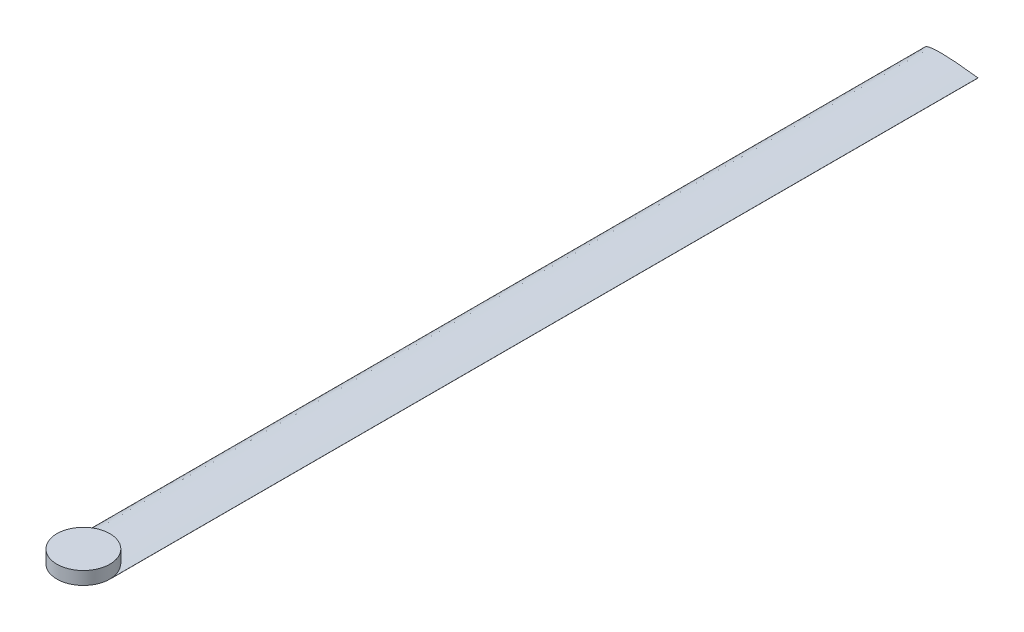
ISO-10303-21;
HEADER;
FILE_DESCRIPTION(('STEP AP214'),'2;1');
FILE_NAME('part.step','',(''),(''),'','','');
FILE_SCHEMA(('AUTOMOTIVE_DESIGN { 1 0 10303 214 1 1 1 1 }'));
ENDSEC;
DATA;
#1=APPLICATION_CONTEXT('core data for automotive mechanical design processes');
#2=APPLICATION_PROTOCOL_DEFINITION('international standard','automotive_design',2000,#1);
#3=PRODUCT_CONTEXT('',#1,'mechanical');
#4=PRODUCT('Part','Part','',(#3));
#5=PRODUCT_RELATED_PRODUCT_CATEGORY('part','',(#4));
#6=PRODUCT_DEFINITION_FORMATION('','',#4);
#7=PRODUCT_DEFINITION_CONTEXT('part definition',#1,'design');
#8=PRODUCT_DEFINITION('design','',#6,#7);
#9=PRODUCT_DEFINITION_SHAPE('','',#8);
#10=(LENGTH_UNIT() NAMED_UNIT(*) SI_UNIT(.MILLI.,.METRE.));
#11=(NAMED_UNIT(*) PLANE_ANGLE_UNIT() SI_UNIT($,.RADIAN.));
#12=(NAMED_UNIT(*) SI_UNIT($,.STERADIAN.) SOLID_ANGLE_UNIT());
#13=UNCERTAINTY_MEASURE_WITH_UNIT(LENGTH_MEASURE(1.E-05),#10,'distance_accuracy_value','');
#14=(GEOMETRIC_REPRESENTATION_CONTEXT(3) GLOBAL_UNCERTAINTY_ASSIGNED_CONTEXT((#13)) GLOBAL_UNIT_ASSIGNED_CONTEXT((#10,
#11,#12)) REPRESENTATION_CONTEXT('',''));
#15=CARTESIAN_POINT('',(0.,0.,0.));
#16=DIRECTION('',(0.,0.,1.));
#17=DIRECTION('',(1.,0.,0.));
#18=AXIS2_PLACEMENT_3D('',#15,#16,#17);
#19=CARTESIAN_POINT('',(51.92458627,0.0654249787001999,-850.9));
#20=CARTESIAN_POINT('',(51.9144783536364,0.0668447481727603,-850.9));
#21=CARTESIAN_POINT('',(51.8740830158601,0.0725187234358362,-850.9));
#22=CARTESIAN_POINT('',(51.7128637741761,0.0950667716006075,-850.9));
#23=CARTESIAN_POINT('',(51.4715233011047,0.128771260971707,-850.9));
#24=CARTESIAN_POINT('',(51.1505590289266,0.173034788527764,-850.9));
#25=CARTESIAN_POINT('',(50.6729577657384,0.238699258043555,-850.9));
#26=CARTESIAN_POINT('',(50.1185157582041,0.313734293269559,-850.9));
#27=CARTESIAN_POINT('',(49.4885484553398,0.397767262475903,-850.9));
#28=CARTESIAN_POINT('',(48.9329284944863,0.470958753954172,-850.9));
#29=CARTESIAN_POINT('',(48.323662112315,0.550211076788461,-850.9));
#30=CARTESIAN_POINT('',(47.6621596521929,0.634888079607421,-850.9));
#31=CARTESIAN_POINT('',(46.6804212513733,0.758797338868999,-850.9));
#32=CARTESIAN_POINT('',(45.6344086297018,0.887388606786109,-850.9));
#33=CARTESIAN_POINT('',(44.5265420078138,1.0200224475314,-850.9));
#34=CARTESIAN_POINT('',(43.6294002554142,1.12535680085555,-850.9));
#35=CARTESIAN_POINT('',(42.6909656012077,1.23317914934233,-850.9));
#36=CARTESIAN_POINT('',(41.7134832049201,1.34321413197957,-850.9));
#37=CARTESIAN_POINT('',(40.6992053320691,1.45467240980085,-850.9));
#38=CARTESIAN_POINT('',(39.6505330297207,1.56725462921075,-850.9));
#39=CARTESIAN_POINT('',(38.5698744395896,1.68015625719945,-850.9));
#40=CARTESIAN_POINT('',(37.4597768936603,1.79316807294359,-850.9));
#41=CARTESIAN_POINT('',(36.3228194278996,1.90541863053479,-850.9));
#42=CARTESIAN_POINT('',(35.161675349151,2.0165553793621,-850.9));
#43=CARTESIAN_POINT('',(33.9790410450409,2.12580642633234,-850.9));
#44=CARTESIAN_POINT('',(32.777675311037,2.23281458710381,-850.9));
#45=CARTESIAN_POINT('',(31.5603913403238,2.33669524197887,-850.9));
#46=CARTESIAN_POINT('',(30.3300258884586,2.43698374361292,-850.9));
#47=CARTESIAN_POINT('',(29.0894680865248,2.53303963360723,-850.9));
#48=CARTESIAN_POINT('',(27.8415994829786,2.6240918225609,-850.9));
#49=CARTESIAN_POINT('',(26.5893526219318,2.70956924053514,-850.9));
#50=CARTESIAN_POINT('',(25.3356506945839,2.78878910813732,-850.9));
#51=CARTESIAN_POINT('',(23.2597463755809,2.90847283819553,-850.9));
#52=CARTESIAN_POINT('',(20.7948097579276,3.02181352063605,-850.9));
#53=CARTESIAN_POINT('',(18.35209977267,3.08909783236487,-850.9));
#54=CARTESIAN_POINT('',(16.3839182784895,3.11769357604497,-850.9));
#55=CARTESIAN_POINT('',(14.852242451324,3.11884802097125,-850.9));
#56=CARTESIAN_POINT('',(13.3547291194537,3.09580791737897,-850.9));
#57=CARTESIAN_POINT('',(11.9352696395051,3.05732465958781,-850.9));
#58=CARTESIAN_POINT('',(10.5601382378665,2.99492912711388,-850.9));
#59=CARTESIAN_POINT('',(9.23317923883581,2.90532852092417,-850.9));
#60=CARTESIAN_POINT('',(8.29460829016419,2.82709313644025,-850.9));
#61=CARTESIAN_POINT('',(7.39728054278529,2.73677746916051,-850.9));
#62=CARTESIAN_POINT('',(6.54328096737141,2.6347241286792,-850.9));
#63=CARTESIAN_POINT('',(5.73457836693464,2.52134793339236,-850.9));
#64=CARTESIAN_POINT('',(4.97307785227524,2.39686022629011,-850.9));
#65=CARTESIAN_POINT('',(4.26052463876455,2.26188317711306,-850.9));
#66=CARTESIAN_POINT('',(3.59855865588192,2.11692431925331,-850.9));
#67=CARTESIAN_POINT('',(2.98872697214177,1.96247504893881,-850.9));
#68=CARTESIAN_POINT('',(2.43237712539489,1.79922727333092,-850.9));
#69=CARTESIAN_POINT('',(1.93073586614819,1.62772313762752,-850.9));
#70=CARTESIAN_POINT('',(1.4848729717453,1.44855497915412,-850.9));
#71=CARTESIAN_POINT('',(1.09567104825382,1.26223966436095,-850.9));
#72=CARTESIAN_POINT('',(0.763871575985361,1.06916509269666,-850.9));
#73=CARTESIAN_POINT('',(0.489860921674484,0.869658563365734,-850.9));
#74=CARTESIAN_POINT('',(0.274168548188181,0.663391899468714,-850.9));
#75=CARTESIAN_POINT('',(0.117314603685006,0.449780781763098,-850.9));
#76=CARTESIAN_POINT('',(0.0214138545634771,0.227781104297802,-850.9));
#77=CARTESIAN_POINT('',(-0.0104380093622145,1.39967940785302E-12,-850.9));
#78=CARTESIAN_POINT('',(0.0214138545634639,-0.22778110429499,-850.9));
#79=CARTESIAN_POINT('',(0.117314603684984,-0.449780781760301,-850.9));
#80=CARTESIAN_POINT('',(0.274168548188143,-0.663391899465917,-850.9));
#81=CARTESIAN_POINT('',(0.489860921674437,-0.869658563362954,-850.9));
#82=CARTESIAN_POINT('',(0.763871575985304,-1.06916509269389,-850.9));
#83=CARTESIAN_POINT('',(1.09567104825375,-1.2622396643582,-850.9));
#84=CARTESIAN_POINT('',(1.48487297174523,-1.4485549791514,-850.9));
#85=CARTESIAN_POINT('',(1.9307358661481,-1.62772313762481,-850.9));
#86=CARTESIAN_POINT('',(2.43237712539479,-1.79922727332824,-850.9));
#87=CARTESIAN_POINT('',(2.98872697214167,-1.96247504893616,-850.9));
#88=CARTESIAN_POINT('',(3.59855865588181,-2.11692431925069,-850.9));
#89=CARTESIAN_POINT('',(4.26052463876442,-2.26188317711048,-850.9));
#90=CARTESIAN_POINT('',(4.97307785227512,-2.39686022628757,-850.9));
#91=CARTESIAN_POINT('',(5.73457836693449,-2.52134793338986,-850.9));
#92=CARTESIAN_POINT('',(6.54328096737127,-2.63472412867675,-850.9));
#93=CARTESIAN_POINT('',(7.39728054278514,-2.7367774691581,-850.9));
#94=CARTESIAN_POINT('',(8.29460829016404,-2.82709313643789,-850.9));
#95=CARTESIAN_POINT('',(9.23317923883565,-2.90532852092186,-850.9));
#96=CARTESIAN_POINT('',(10.5601382378664,-2.99492912711164,-850.9));
#97=CARTESIAN_POINT('',(11.935269639505,-3.05732465958565,-850.9));
#98=CARTESIAN_POINT('',(13.3547291194535,-3.09580791737688,-850.9));
#99=CARTESIAN_POINT('',(14.8522424513238,-3.11884802096924,-850.9));
#100=CARTESIAN_POINT('',(16.3839182784893,-3.11769357604306,-850.9));
#101=CARTESIAN_POINT('',(18.3520997726698,-3.08909783236305,-850.9));
#102=CARTESIAN_POINT('',(20.3781183845229,-3.03329126151724,-850.9));
#103=CARTESIAN_POINT('',(22.425332849603,-2.94682683555158,-850.9));
#104=CARTESIAN_POINT('',(24.0833956272909,-2.86098634577627,-850.9));
#105=CARTESIAN_POINT('',(25.3356506945838,-2.78878910813588,-850.9));
#106=CARTESIAN_POINT('',(26.5893526219316,-2.70956924053377,-850.9));
#107=CARTESIAN_POINT('',(27.8415994829784,-2.6240918225596,-850.9));
#108=CARTESIAN_POINT('',(29.0894680865247,-2.53303963360599,-850.9));
#109=CARTESIAN_POINT('',(30.3300258884584,-2.43698374361175,-850.9));
#110=CARTESIAN_POINT('',(31.5603913403237,-2.33669524197777,-850.9));
#111=CARTESIAN_POINT('',(32.7776753110368,-2.23281458710278,-850.9));
#112=CARTESIAN_POINT('',(33.9790410450408,-2.12580642633137,-850.9));
#113=CARTESIAN_POINT('',(35.1616753491508,-2.0165553793612,-850.9));
#114=CARTESIAN_POINT('',(36.3228194278995,-1.90541863053395,-850.9));
#115=CARTESIAN_POINT('',(37.4597768936601,-1.79316807294281,-850.9));
#116=CARTESIAN_POINT('',(38.5698744395896,-1.68015625719873,-850.9));
#117=CARTESIAN_POINT('',(39.6505330297206,-1.56725462921009,-850.9));
#118=CARTESIAN_POINT('',(40.6992053320691,-1.45467240980024,-850.9));
#119=CARTESIAN_POINT('',(41.71348320492,-1.34321413197902,-850.9));
#120=CARTESIAN_POINT('',(42.6909656012077,-1.23317914934183,-850.9));
#121=CARTESIAN_POINT('',(43.6294002554142,-1.1253568008551,-850.9));
#122=CARTESIAN_POINT('',(44.5265420078137,-1.020022447531,-850.9));
#123=CARTESIAN_POINT('',(45.6344086297018,-0.887388606785768,-850.9));
#124=CARTESIAN_POINT('',(46.6804212513733,-0.758797338868717,-850.9));
#125=CARTESIAN_POINT('',(47.6621596521928,-0.63488807960719,-850.9));
#126=CARTESIAN_POINT('',(48.3236621123149,-0.550211076788267,-850.9));
#127=CARTESIAN_POINT('',(48.9329284944863,-0.47095875395401,-850.9));
#128=CARTESIAN_POINT('',(49.4885484553397,-0.397767262475771,-850.9));
#129=CARTESIAN_POINT('',(50.1185157582041,-0.313734293269462,-850.9));
#130=CARTESIAN_POINT('',(50.6729577657383,-0.238699258043488,-850.9));
#131=CARTESIAN_POINT('',(51.1505590289266,-0.173034788527721,-850.9));
#132=CARTESIAN_POINT('',(51.4715233011047,-0.128771260971681,-850.9));
#133=CARTESIAN_POINT('',(51.7128637741761,-0.0950667716005953,-850.9));
#134=CARTESIAN_POINT('',(51.8740830158602,-0.072518723435834,-850.9));
#135=CARTESIAN_POINT('',(51.9144783536364,-0.0668447481727592,-850.9));
#136=CARTESIAN_POINT('',(51.92458627,-0.0654249787001999,-850.9));
#137=B_SPLINE_CURVE_WITH_KNOTS('',3,(#19,#20,#21,#22,#23,#24,#25,#26,#27,#28,#29,#30,#31,#32,
#33,#34,#35,#36,#37,#38,#39,#40,#41,#42,#43,#44,#45,#46,#47,#48,#49,#50,#51,#52,#53,#54,#55,#56,
#57,#58,#59,#60,#61,#62,#63,#64,#65,#66,#67,#68,#69,#70,#71,#72,#73,#74,#75,#76,#77,#78,#79,#80,
#81,#82,#83,#84,#85,#86,#87,#88,#89,#90,#91,#92,#93,#94,#95,#96,#97,#98,#99,#100,#101,#102,#103,
#104,#105,#106,#107,#108,#109,#110,#111,#112,#113,#114,#115,#116,#117,#118,#119,#120,#121,#122,
#123,#124,#125,#126,#127,#128,#129,#130,#131,#132,#133,#134,#135,#136),.UNSPECIFIED.,.F.,.F.,(4,
1,1,1,1,1,1,1,1,1,1,1,1,1,1,1,1,1,1,1,1,1,1,1,1,1,1,1,1,1,1,1,1,1,1,1,1,1,1,1,1,1,1,1,1,1,1,1,1,
1,1,1,1,1,1,1,1,1,1,1,1,1,1,1,1,1,1,1,1,1,1,1,1,1,1,1,1,1,1,1,1,1,1,1,1,1,1,1,1,1,1,1,1,1,1,1,1,
1,1,1,1,1,1,1,1,1,1,1,1,1,1,1,1,1,1,4),(0.,0.000289201378228584,0.00115576612811508,
0.00461232240327471,0.00719351750498146,0.0103357928948401,0.0182716120853123,
0.0230458473649681,0.0283429008690871,0.0341501195438393,0.0404537601194177,0.0472383298988339,
0.0621866127014251,0.0703137241968131,0.0788519079930911,0.0877801263970524,0.0970775209084771,
0.106722048517726,0.116690867689892,0.126960504753417,0.137507218023907,0.148306054540842,
0.159330764906486,0.170556489755233,0.181956531155254,0.193504043461122,0.205171366742429,
0.216932300344852,0.228758168756788,0.240621400483931,0.252494935762872,0.264350287074715,
0.299535853600575,0.322404758964058,0.333584031906799,0.35530595971865,0.365799778375851,
0.376017570419826,0.395537658905913,0.404797976198219,0.413698812078543,0.422221441287427,
0.430349273099823,0.438066019294824,0.445356904422305,0.452209372098903,0.458611567079498,
0.464554044050621,0.470029850192537,0.475034902370301,0.479569141493347,0.483636857140142,
0.487250262770083,0.490431337960153,0.493218828079602,0.495674085869199,0.497891368316545,0.5,
0.502108631683455,0.504325914130801,0.506781171920398,0.509568662039847,0.512749737229918,
0.516363142859858,0.520430858506654,0.524965097629699,0.529970149807464,0.53544595594938,
0.541388432920502,0.547790627901097,0.554643095577695,0.561933980705176,0.569650726900178,
0.577778558712573,0.586301187921457,0.595202023801781,0.604462341094087,0.623982429580174,
0.634200221624149,0.64469404028135,0.666415968093201,0.677595241035943,0.700464146399425,
0.723839426647284,0.735649712925285,0.747505064237128,0.75937859951607,0.771241831243213,
0.783067699655148,0.794828633257572,0.806495956538878,0.818043468844746,0.829443510244768,
0.840669235093514,0.851693945459158,0.862492781976093,0.873039495246583,0.883309132310108,
0.893277951482274,0.902922479091523,0.912219873602948,0.921148092006909,0.929686275803187,
0.937813387298575,0.952761670101166,0.959546239880582,0.965849880456161,0.971657099130913,
0.976954152635032,0.981728387914688,0.98966420710516,0.992806482495019,0.995387677596725,
0.998844233871885,0.999710798621771,1.),.UNSPECIFIED.);
#138=DIRECTION('',(0.,0.,1.));
#139=VECTOR('',#138,1.);
#140=SURFACE_OF_LINEAR_EXTRUSION('',#137,#139);
#141=CARTESIAN_POINT('',(51.92458627,0.0654249787001999,0.));
#142=CARTESIAN_POINT('',(51.9144783536364,0.0668447481727603,0.));
#143=CARTESIAN_POINT('',(51.8740830158601,0.0725187234358362,0.));
#144=CARTESIAN_POINT('',(51.7128637741761,0.0950667716006075,0.));
#145=CARTESIAN_POINT('',(51.4715233011047,0.128771260971707,0.));
#146=CARTESIAN_POINT('',(51.1505590289266,0.173034788527764,0.));
#147=CARTESIAN_POINT('',(50.6729577657384,0.238699258043555,0.));
#148=CARTESIAN_POINT('',(50.1185157582041,0.313734293269559,0.));
#149=CARTESIAN_POINT('',(49.4885484553398,0.397767262475903,0.));
#150=CARTESIAN_POINT('',(48.9329284944863,0.470958753954172,0.));
#151=CARTESIAN_POINT('',(48.323662112315,0.550211076788461,0.));
#152=CARTESIAN_POINT('',(47.6621596521929,0.634888079607421,0.));
#153=CARTESIAN_POINT('',(46.6804212513733,0.758797338868999,0.));
#154=CARTESIAN_POINT('',(45.6344086297018,0.887388606786109,0.));
#155=CARTESIAN_POINT('',(44.5265420078138,1.0200224475314,0.));
#156=CARTESIAN_POINT('',(43.6294002554142,1.12535680085555,0.));
#157=CARTESIAN_POINT('',(42.6909656012077,1.23317914934233,0.));
#158=CARTESIAN_POINT('',(41.7134832049201,1.34321413197957,0.));
#159=CARTESIAN_POINT('',(40.6992053320691,1.45467240980085,0.));
#160=CARTESIAN_POINT('',(39.6505330297207,1.56725462921075,0.));
#161=CARTESIAN_POINT('',(38.5698744395896,1.68015625719945,0.));
#162=CARTESIAN_POINT('',(37.4597768936603,1.79316807294359,0.));
#163=CARTESIAN_POINT('',(36.3228194278996,1.90541863053479,0.));
#164=CARTESIAN_POINT('',(35.161675349151,2.0165553793621,0.));
#165=CARTESIAN_POINT('',(33.9790410450409,2.12580642633234,0.));
#166=CARTESIAN_POINT('',(32.777675311037,2.23281458710381,0.));
#167=CARTESIAN_POINT('',(31.5603913403238,2.33669524197887,0.));
#168=CARTESIAN_POINT('',(30.3300258884586,2.43698374361292,0.));
#169=CARTESIAN_POINT('',(29.0894680865248,2.53303963360723,0.));
#170=CARTESIAN_POINT('',(27.8415994829786,2.6240918225609,0.));
#171=CARTESIAN_POINT('',(26.5893526219318,2.70956924053514,0.));
#172=CARTESIAN_POINT('',(25.3356506945839,2.78878910813732,0.));
#173=CARTESIAN_POINT('',(23.2597463755809,2.90847283819553,0.));
#174=CARTESIAN_POINT('',(20.7948097579276,3.02181352063605,0.));
#175=CARTESIAN_POINT('',(18.35209977267,3.08909783236487,0.));
#176=CARTESIAN_POINT('',(16.3839182784895,3.11769357604497,0.));
#177=CARTESIAN_POINT('',(14.852242451324,3.11884802097125,0.));
#178=CARTESIAN_POINT('',(13.3547291194537,3.09580791737897,0.));
#179=CARTESIAN_POINT('',(11.9352696395051,3.05732465958781,0.));
#180=CARTESIAN_POINT('',(10.5601382378665,2.99492912711388,0.));
#181=CARTESIAN_POINT('',(9.23317923883581,2.90532852092417,0.));
#182=CARTESIAN_POINT('',(8.29460829016419,2.82709313644025,0.));
#183=CARTESIAN_POINT('',(7.39728054278529,2.73677746916051,0.));
#184=CARTESIAN_POINT('',(6.54328096737141,2.6347241286792,0.));
#185=CARTESIAN_POINT('',(5.73457836693464,2.52134793339236,0.));
#186=CARTESIAN_POINT('',(4.97307785227524,2.39686022629011,0.));
#187=CARTESIAN_POINT('',(4.26052463876455,2.26188317711306,0.));
#188=CARTESIAN_POINT('',(3.59855865588192,2.11692431925331,0.));
#189=CARTESIAN_POINT('',(2.98872697214177,1.96247504893881,0.));
#190=CARTESIAN_POINT('',(2.43237712539489,1.79922727333092,0.));
#191=CARTESIAN_POINT('',(1.93073586614819,1.62772313762752,0.));
#192=CARTESIAN_POINT('',(1.4848729717453,1.44855497915412,0.));
#193=CARTESIAN_POINT('',(1.09567104825382,1.26223966436095,0.));
#194=CARTESIAN_POINT('',(0.763871575985361,1.06916509269666,0.));
#195=CARTESIAN_POINT('',(0.489860921674484,0.869658563365734,0.));
#196=CARTESIAN_POINT('',(0.274168548188181,0.663391899468714,0.));
#197=CARTESIAN_POINT('',(0.117314603685006,0.449780781763098,0.));
#198=CARTESIAN_POINT('',(0.0214138545634771,0.227781104297802,0.));
#199=CARTESIAN_POINT('',(-0.0104380093622145,1.39967940785302E-12,0.));
#200=CARTESIAN_POINT('',(0.0214138545634639,-0.22778110429499,0.));
#201=CARTESIAN_POINT('',(0.117314603684984,-0.449780781760301,0.));
#202=CARTESIAN_POINT('',(0.274168548188143,-0.663391899465917,0.));
#203=CARTESIAN_POINT('',(0.489860921674437,-0.869658563362954,0.));
#204=CARTESIAN_POINT('',(0.763871575985304,-1.06916509269389,0.));
#205=CARTESIAN_POINT('',(1.09567104825375,-1.2622396643582,0.));
#206=CARTESIAN_POINT('',(1.48487297174523,-1.4485549791514,0.));
#207=CARTESIAN_POINT('',(1.9307358661481,-1.62772313762481,0.));
#208=CARTESIAN_POINT('',(2.43237712539479,-1.79922727332824,0.));
#209=CARTESIAN_POINT('',(2.98872697214167,-1.96247504893616,0.));
#210=CARTESIAN_POINT('',(3.59855865588181,-2.11692431925069,0.));
#211=CARTESIAN_POINT('',(4.26052463876442,-2.26188317711048,0.));
#212=CARTESIAN_POINT('',(4.97307785227512,-2.39686022628757,0.));
#213=CARTESIAN_POINT('',(5.73457836693449,-2.52134793338986,0.));
#214=CARTESIAN_POINT('',(6.54328096737127,-2.63472412867675,0.));
#215=CARTESIAN_POINT('',(7.39728054278514,-2.7367774691581,0.));
#216=CARTESIAN_POINT('',(8.29460829016404,-2.82709313643789,0.));
#217=CARTESIAN_POINT('',(9.23317923883565,-2.90532852092186,0.));
#218=CARTESIAN_POINT('',(10.5601382378664,-2.99492912711164,0.));
#219=CARTESIAN_POINT('',(11.935269639505,-3.05732465958565,0.));
#220=CARTESIAN_POINT('',(13.3547291194535,-3.09580791737688,0.));
#221=CARTESIAN_POINT('',(14.8522424513238,-3.11884802096924,0.));
#222=CARTESIAN_POINT('',(16.3839182784893,-3.11769357604306,0.));
#223=CARTESIAN_POINT('',(18.3520997726698,-3.08909783236305,0.));
#224=CARTESIAN_POINT('',(20.3781183845229,-3.03329126151724,0.));
#225=CARTESIAN_POINT('',(22.425332849603,-2.94682683555158,0.));
#226=CARTESIAN_POINT('',(24.0833956272909,-2.86098634577627,0.));
#227=CARTESIAN_POINT('',(25.3356506945838,-2.78878910813588,0.));
#228=CARTESIAN_POINT('',(26.5893526219316,-2.70956924053377,0.));
#229=CARTESIAN_POINT('',(27.8415994829784,-2.6240918225596,0.));
#230=CARTESIAN_POINT('',(29.0894680865247,-2.53303963360599,0.));
#231=CARTESIAN_POINT('',(30.3300258884584,-2.43698374361175,0.));
#232=CARTESIAN_POINT('',(31.5603913403237,-2.33669524197777,0.));
#233=CARTESIAN_POINT('',(32.7776753110368,-2.23281458710278,0.));
#234=CARTESIAN_POINT('',(33.9790410450408,-2.12580642633137,0.));
#235=CARTESIAN_POINT('',(35.1616753491508,-2.0165553793612,0.));
#236=CARTESIAN_POINT('',(36.3228194278995,-1.90541863053395,0.));
#237=CARTESIAN_POINT('',(37.4597768936601,-1.79316807294281,0.));
#238=CARTESIAN_POINT('',(38.5698744395896,-1.68015625719873,0.));
#239=CARTESIAN_POINT('',(39.6505330297206,-1.56725462921009,0.));
#240=CARTESIAN_POINT('',(40.6992053320691,-1.45467240980024,0.));
#241=CARTESIAN_POINT('',(41.71348320492,-1.34321413197902,0.));
#242=CARTESIAN_POINT('',(42.6909656012077,-1.23317914934183,0.));
#243=CARTESIAN_POINT('',(43.6294002554142,-1.1253568008551,0.));
#244=CARTESIAN_POINT('',(44.5265420078137,-1.020022447531,0.));
#245=CARTESIAN_POINT('',(45.6344086297018,-0.887388606785768,0.));
#246=CARTESIAN_POINT('',(46.6804212513733,-0.758797338868717,0.));
#247=CARTESIAN_POINT('',(47.6621596521928,-0.63488807960719,0.));
#248=CARTESIAN_POINT('',(48.3236621123149,-0.550211076788267,0.));
#249=CARTESIAN_POINT('',(48.9329284944863,-0.47095875395401,0.));
#250=CARTESIAN_POINT('',(49.4885484553397,-0.397767262475771,0.));
#251=CARTESIAN_POINT('',(50.1185157582041,-0.313734293269462,0.));
#252=CARTESIAN_POINT('',(50.6729577657383,-0.238699258043488,0.));
#253=CARTESIAN_POINT('',(51.1505590289266,-0.173034788527721,0.));
#254=CARTESIAN_POINT('',(51.4715233011047,-0.128771260971681,0.));
#255=CARTESIAN_POINT('',(51.7128637741761,-0.0950667716005953,0.));
#256=CARTESIAN_POINT('',(51.8740830158602,-0.072518723435834,0.));
#257=CARTESIAN_POINT('',(51.9144783536364,-0.0668447481727592,0.));
#258=CARTESIAN_POINT('',(51.92458627,-0.0654249787001999,0.));
#259=B_SPLINE_CURVE_WITH_KNOTS('',3,(#141,#142,#143,#144,#145,#146,#147,#148,#149,#150,#151,
#152,#153,#154,#155,#156,#157,#158,#159,#160,#161,#162,#163,#164,#165,#166,#167,#168,#169,#170,
#171,#172,#173,#174,#175,#176,#177,#178,#179,#180,#181,#182,#183,#184,#185,#186,#187,#188,#189,
#190,#191,#192,#193,#194,#195,#196,#197,#198,#199,#200,#201,#202,#203,#204,#205,#206,#207,#208,
#209,#210,#211,#212,#213,#214,#215,#216,#217,#218,#219,#220,#221,#222,#223,#224,#225,#226,#227,
#228,#229,#230,#231,#232,#233,#234,#235,#236,#237,#238,#239,#240,#241,#242,#243,#244,#245,#246,
#247,#248,#249,#250,#251,#252,#253,#254,#255,#256,#257,#258),.UNSPECIFIED.,.F.,.F.,(4,1,1,1,1,1,
1,1,1,1,1,1,1,1,1,1,1,1,1,1,1,1,1,1,1,1,1,1,1,1,1,1,1,1,1,1,1,1,1,1,1,1,1,1,1,1,1,1,1,1,1,1,1,1,
1,1,1,1,1,1,1,1,1,1,1,1,1,1,1,1,1,1,1,1,1,1,1,1,1,1,1,1,1,1,1,1,1,1,1,1,1,1,1,1,1,1,1,1,1,1,1,1,
1,1,1,1,1,1,1,1,1,1,1,1,1,4),(0.,0.000289201378228584,0.00115576612811508,0.00461232240327471,
0.00719351750498146,0.0103357928948401,0.0182716120853123,0.0230458473649681,0.0283429008690871,
0.0341501195438393,0.0404537601194177,0.0472383298988339,0.0621866127014251,0.0703137241968131,
0.0788519079930911,0.0877801263970524,0.0970775209084771,0.106722048517726,0.116690867689892,
0.126960504753417,0.137507218023907,0.148306054540842,0.159330764906486,0.170556489755233,
0.181956531155254,0.193504043461122,0.205171366742429,0.216932300344852,0.228758168756788,
0.240621400483931,0.252494935762872,0.264350287074715,0.299535853600575,0.322404758964058,
0.333584031906799,0.35530595971865,0.365799778375851,0.376017570419826,0.395537658905913,
0.404797976198219,0.413698812078543,0.422221441287427,0.430349273099823,0.438066019294824,
0.445356904422305,0.452209372098903,0.458611567079498,0.464554044050621,0.470029850192537,
0.475034902370301,0.479569141493347,0.483636857140142,0.487250262770083,0.490431337960153,
0.493218828079602,0.495674085869199,0.497891368316545,0.5,0.502108631683455,0.504325914130801,
0.506781171920398,0.509568662039847,0.512749737229918,0.516363142859858,0.520430858506654,
0.524965097629699,0.529970149807464,0.53544595594938,0.541388432920502,0.547790627901097,
0.554643095577695,0.561933980705176,0.569650726900178,0.577778558712573,0.586301187921457,
0.595202023801781,0.604462341094087,0.623982429580174,0.634200221624149,0.64469404028135,
0.666415968093201,0.677595241035943,0.700464146399425,0.723839426647284,0.735649712925285,
0.747505064237128,0.75937859951607,0.771241831243213,0.783067699655148,0.794828633257572,
0.806495956538878,0.818043468844746,0.829443510244768,0.840669235093514,0.851693945459158,
0.862492781976093,0.873039495246583,0.883309132310108,0.893277951482274,0.902922479091523,
0.912219873602948,0.921148092006909,0.929686275803187,0.937813387298575,0.952761670101166,
0.959546239880582,0.965849880456161,0.971657099130913,0.976954152635032,0.981728387914688,
0.98966420710516,0.992806482495019,0.995387677596725,0.998844233871885,0.999710798621771,1.),.UNSPECIFIED.);
#260=CARTESIAN_POINT('',(0.,0.,0.));
#261=VERTEX_POINT('',#260);
#262=CARTESIAN_POINT('',(51.92458627,-0.0654249787001999,0.));
#263=VERTEX_POINT('',#262);
#264=EDGE_CURVE('E71',#261,#263,#259,.T.);
#265=ORIENTED_EDGE('',*,*,#264,.F.);
#266=CARTESIAN_POINT('',(51.92458627,0.0654249787001999,2.22044604925031E-13));
#267=CARTESIAN_POINT('',(51.9246024349537,0.0654319013516218,-0.483924923424878));
#268=CARTESIAN_POINT('',(51.9110566506078,0.067333498231014,-0.967847104331572));
#269=CARTESIAN_POINT('',(51.856960129875,0.0749085511023549,-1.93411296626482));
#270=CARTESIAN_POINT('',(51.8164114739358,0.0805817165121657,-2.4164567660216));
#271=CARTESIAN_POINT('',(51.7084295367832,0.095682225767022,-3.37805529288603));
#272=CARTESIAN_POINT('',(51.6409969596283,0.105109471297077,-3.85731010055681));
#273=CARTESIAN_POINT('',(51.4795650988934,0.127567714886221,-4.81071866192936));
#274=CARTESIAN_POINT('',(51.3855934792698,0.140594960049606,-5.28487719647028));
#275=CARTESIAN_POINT('',(51.1713573456199,0.170177231273281,-6.22713039958657));
#276=CARTESIAN_POINT('',(51.0510929477026,0.18673224175493,-6.69522509493022));
#277=CARTESIAN_POINT('',(50.8513055568519,0.214121897600095,-7.39162100659352));
#278=CARTESIAN_POINT('',(50.7814785585492,0.223677891476073,-7.6227935728181));
#279=CARTESIAN_POINT('',(50.6354013670503,0.243604167523657,-8.08311385169019));
#280=CARTESIAN_POINT('',(50.5591497800446,0.253974626359505,-8.31226111297359));
#281=CARTESIAN_POINT('',(50.2414281306314,0.297059215804232,-9.22435850575393));
#282=CARTESIAN_POINT('',(49.974477259162,0.33298572829686,-9.89849155005871));
#283=CARTESIAN_POINT('',(49.3852795499572,0.411420861744221,-11.2218127862979));
#284=CARTESIAN_POINT('',(49.0630251108292,0.45393038744573,-11.8709975340935));
#285=CARTESIAN_POINT('',(48.5400435738696,0.522039291370124,-12.8225172541101));
#286=CARTESIAN_POINT('',(48.3590962335342,0.545468935722415,-13.1360113230774));
#287=CARTESIAN_POINT('',(47.9843617595143,0.593647751557944,-13.7550000778615));
#288=CARTESIAN_POINT('',(47.790578257341,0.618396549452349,-14.0604969923377));
#289=CARTESIAN_POINT('',(47.1903576614317,0.694556364685788,-14.9643881550641));
#290=CARTESIAN_POINT('',(46.76502311941,0.747884375359731,-15.5502325784871));
#291=CARTESIAN_POINT('',(45.8648035405842,0.858948490391637,-16.6871072937729));
#292=CARTESIAN_POINT('',(45.3896635805429,0.916706822383088,-17.2379327318155));
#293=CARTESIAN_POINT('',(44.3949632220318,1.03558196819598,-18.297683066705));
#294=CARTESIAN_POINT('',(43.8754026169756,1.09669879763627,-18.8066077686633));
#295=CARTESIAN_POINT('',(43.0656649808772,1.19012194432523,-19.5357998033698));
#296=CARTESIAN_POINT('',(42.7906308753879,1.22156048235458,-19.7732067234141));
#297=CARTESIAN_POINT('',(42.2308620897487,1.28496571543657,-20.2362599879064));
#298=CARTESIAN_POINT('',(41.9461274242805,1.31693240968979,-20.4619063501529));
#299=CARTESIAN_POINT('',(41.3674818482818,1.38120435009176,-20.9010226352852));
#300=CARTESIAN_POINT('',(41.0735713129411,1.41350958236232,-21.1144930550237));
#301=CARTESIAN_POINT('',(40.4770498100624,1.47841704751187,-21.528920483309));
#302=CARTESIAN_POINT('',(40.174438059553,1.51101930693714,-21.7298763605621));
#303=CARTESIAN_POINT('',(39.5588825920299,1.57656107615066,-22.1202884922569));
#304=CARTESIAN_POINT('',(39.2458809806798,1.60950134122236,-22.3096534627253));
#305=CARTESIAN_POINT('',(38.6121659675613,1.67543677233903,-22.6749914350086));
#306=CARTESIAN_POINT('',(38.2914518900809,1.708431942957,-22.8509632577436));
#307=CARTESIAN_POINT('',(37.3185600195433,1.80726320782689,-23.3583058521384));
#308=CARTESIAN_POINT('',(36.6554715401786,1.87296227888871,-23.6692058761102));
#309=CARTESIAN_POINT('',(35.6431206842424,1.97045526970832,-24.0926602712318));
#310=CARTESIAN_POINT('',(35.3026744190165,2.00278090772618,-24.2266763048157));
#311=CARTESIAN_POINT('',(34.6163893953621,2.06693018946345,-24.4802168134357));
#312=CARTESIAN_POINT('',(34.2705512398616,2.09875388852102,-24.5997428958246));
#313=CARTESIAN_POINT('',(33.5740673577504,2.16182842403234,-24.8240897155777));
#314=CARTESIAN_POINT('',(33.2234213668392,2.19307922876998,-24.928909640916));
#315=CARTESIAN_POINT('',(32.5179707091269,2.25479388096146,-25.1236481022296));
#316=CARTESIAN_POINT('',(32.1631660414992,2.28525772825886,-25.2135666352424));
#317=CARTESIAN_POINT('',(31.0924990746755,2.37540731788201,-25.4609201436088));
#318=CARTESIAN_POINT('',(30.3711469663177,2.43378169665777,-25.5957072185541));
#319=CARTESIAN_POINT('',(28.919354927948,2.54576562935529,-25.803766964825));
#320=CARTESIAN_POINT('',(28.188914974649,2.59937517106453,-25.8770394784898));
#321=CARTESIAN_POINT('',(26.7240068952321,2.70067353674767,-25.9614839346194));
#322=CARTESIAN_POINT('',(25.9895387285901,2.74836230104364,-25.9726552511905));
#323=CARTESIAN_POINT('',(24.521869831077,2.83653514551913,-25.9326969590533));
#324=CARTESIAN_POINT('',(23.7886690912291,2.87701927693621,-25.881567793431));
#325=CARTESIAN_POINT('',(22.3339120894891,2.94932995638361,-25.7178452107202));
#326=CARTESIAN_POINT('',(21.6123102970121,2.98121481379388,-25.6056821669611));
#327=CARTESIAN_POINT('',(20.1807687329199,3.03559739753679,-25.3208847736388));
#328=CARTESIAN_POINT('',(19.4708289186035,3.05809515824825,-25.1482506455461));
#329=CARTESIAN_POINT('',(18.0679107572095,3.09263569279422,-24.7437334507727));
#330=CARTESIAN_POINT('',(17.3749298950136,3.10468002618105,-24.5118592288363));
#331=CARTESIAN_POINT('',(16.0108012662465,3.11741368959268,-23.9904449491359));
#332=CARTESIAN_POINT('',(15.3396532450276,3.11810315210261,-23.7009055642312));
#333=CARTESIAN_POINT('',(14.3576247144391,3.11026348696746,-23.2271875863904));
#334=CARTESIAN_POINT('',(14.0364591598246,3.10622703553367,-23.0639302621259));
#335=CARTESIAN_POINT('',(13.4012364341158,3.09515975029526,-22.7242215277137));
#336=CARTESIAN_POINT('',(13.0871792433265,3.08812892478821,-22.5477701541287));
#337=CARTESIAN_POINT('',(12.1565537539792,3.06252229399305,-21.9991051213492));
#338=CARTESIAN_POINT('',(11.5513831658046,3.0394311885775,-21.6075089486977));
#339=CARTESIAN_POINT('',(10.3759867303933,2.98105745862638,-20.7756205871723));
#340=CARTESIAN_POINT('',(9.8057702641662,2.94577157796931,-20.3353154139002));
#341=CARTESIAN_POINT('',(8.7043934544161,2.86311932638502,-19.4093574979036));
#342=CARTESIAN_POINT('',(8.1732322563642,2.81575321987441,-18.92370574789));
#343=CARTESIAN_POINT('',(7.15602258470197,2.70959431678572,-17.9130203568359));
#344=CARTESIAN_POINT('',(6.66976953079896,2.65085754194599,-17.3881872434287));
#345=CARTESIAN_POINT('',(5.97462205330321,2.55460599594988,-16.5729109051972));
#346=CARTESIAN_POINT('',(5.74857958769537,2.521158670935,-16.2964365320694));
#347=CARTESIAN_POINT('',(5.30823801931082,2.45160294066289,-15.7346131513049));
#348=CARTESIAN_POINT('',(5.09393885106722,2.41549455024328,-15.4492641931564));
#349=CARTESIAN_POINT('',(4.46968721678419,2.30348273957791,-14.5813548006438));
#350=CARTESIAN_POINT('',(4.07774558600803,2.22380434139338,-13.9861865445799));
#351=CARTESIAN_POINT('',(3.34473108444745,2.05525941128443,-12.7668488073542));
#352=CARTESIAN_POINT('',(3.00364059181106,1.9663960804491,-12.1426894715045));
#353=CARTESIAN_POINT('',(2.53141697595028,1.82695561895383,-11.1875446406161));
#354=CARTESIAN_POINT('',(2.38048497429549,1.77941540062285,-10.8657776663762));
#355=CARTESIAN_POINT('',(2.09207692364538,1.68241718038919,-10.216633066226));
#356=CARTESIAN_POINT('',(1.95459853791165,1.63295951361617,-9.88925642629903));
#357=CARTESIAN_POINT('',(1.5627761991025,1.48193912797231,-8.89983010430909));
#358=CARTESIAN_POINT('',(1.32878050737732,1.37765071389105,-8.22994852085402));
#359=CARTESIAN_POINT('',(1.03101337784806,1.2224633325345,-7.25062230038794));
#360=CARTESIAN_POINT('',(0.944823420116001,1.17404231654507,-6.94738731888394));
#361=CARTESIAN_POINT('',(0.823888471837695,1.10049598141197,-6.49046118569987));
#362=CARTESIAN_POINT('',(0.78496808476224,1.07582777687357,-6.33780508463107));
#363=CARTESIAN_POINT('',(0.709921326771744,1.0262432376337,-6.03184867261324));
#364=CARTESIAN_POINT('',(0.673794996294466,1.00132689934693,-5.8785483523744));
#365=CARTESIAN_POINT('',(0.5696332255704,0.926131392984203,-5.41780714683606));
#366=CARTESIAN_POINT('',(0.505801229978077,0.875397378073631,-5.10947395835363));
#367=CARTESIAN_POINT('',(0.418518101630959,0.798583620123908,-4.64553423227945));
#368=CARTESIAN_POINT('',(0.390834686820013,0.772860412205784,-4.49064866474348));
#369=CARTESIAN_POINT('',(0.338295107909771,0.721124192920162,-4.18044674469043));
#370=CARTESIAN_POINT('',(0.313438899411868,0.695111186110728,-4.02513039897756));
#371=CARTESIAN_POINT('',(0.26611137846221,0.642376035782092,-3.7111443666109));
#372=CARTESIAN_POINT('',(0.243694523682177,0.615649823818793,-3.55246716736741));
#373=CARTESIAN_POINT('',(0.201807797125371,0.56196149418822,-3.23476901997043));
#374=CARTESIAN_POINT('',(0.182337834915419,0.534999383786984,-3.07574808251741));
#375=CARTESIAN_POINT('',(0.146352823001555,0.48080168187,-2.75745132249109));
#376=CARTESIAN_POINT('',(0.129837192300775,0.453566145241193,-2.59817555626225));
#377=CARTESIAN_POINT('',(0.0997589573847406,0.398839544542385,-2.27939102670183));
#378=CARTESIAN_POINT('',(0.086196327512163,0.371348482694694,-2.11988226540677));
#379=CARTESIAN_POINT('',(0.0619668653572338,0.316060821463782,-1.79989747700188));
#380=CARTESIAN_POINT('',(0.0513143618468763,0.288263387333495,-1.63942050403762));
#381=CARTESIAN_POINT('',(0.0375749754179283,0.24637437012582,-1.39861276997065));
#382=CARTESIAN_POINT('',(0.0333683909196638,0.232379141712419,-1.31832769957955));
#383=CARTESIAN_POINT('',(0.0257019756918662,0.204274613546411,-1.15774164234765));
#384=CARTESIAN_POINT('',(0.0222421465916767,0.190165313544981,-1.0774406554725));
#385=CARTESIAN_POINT('',(0.0129736305453044,0.147692926221437,-0.836294944228672));
#386=CARTESIAN_POINT('',(0.00828830772875959,0.119223240481502,-0.675424676505484));
#387=CARTESIAN_POINT('',(0.00190962425800206,0.0623089545508442,-0.353624788138128));
#388=CARTESIAN_POINT('',(0.000216168101722328,0.0338643535883722,-0.192695169552494));
#389=CARTESIAN_POINT('',(6.46755171067333E-06,0.00371674199369455,-0.0211598042348529));
#390=CARTESIAN_POINT('',(4.07949465129101E-10,0.00185801265308585,-0.0105799574262696));
#391=CARTESIAN_POINT('',(0.,1.37763507347284E-12,0.));
#392=B_SPLINE_CURVE_WITH_KNOTS('',3,(#266,#267,#268,#269,#270,#271,#272,#273,#274,#275,#276,
#277,#278,#279,#280,#281,#282,#283,#284,#285,#286,#287,#288,#289,#290,#291,#292,#293,#294,#295,
#296,#297,#298,#299,#300,#301,#302,#303,#304,#305,#306,#307,#308,#309,#310,#311,#312,#313,#314,
#315,#316,#317,#318,#319,#320,#321,#322,#323,#324,#325,#326,#327,#328,#329,#330,#331,#332,#333,
#334,#335,#336,#337,#338,#339,#340,#341,#342,#343,#344,#345,#346,#347,#348,#349,#350,#351,#352,
#353,#354,#355,#356,#357,#358,#359,#360,#361,#362,#363,#364,#365,#366,#367,#368,#369,#370,#371,
#372,#373,#374,#375,#376,#377,#378,#379,#380,#381,#382,#383,#384,#385,#386,#387,#388,#389,#390,
#391),.UNSPECIFIED.,.F.,.F.,(4,2,2,2,2,2,2,2,2,2,2,2,2,2,2,2,2,2,2,2,2,2,2,2,2,2,2,2,2,2,2,2,2,
2,2,2,2,2,2,2,2,2,2,2,2,2,2,2,2,2,2,2,2,2,2,2,2,2,2,2,2,2,4),(0.,1.45157713008569,
2.90304243573892,4.35446973170427,5.8043896276551,7.25430312088022,7.979248971005,
8.70435250454241,10.8794026255739,13.0547519437751,14.1426453536117,15.2302322885416,
17.405236015153,19.591972828213,21.7787198116492,22.8725112272702,23.9663009875055,
25.0600460824806,26.1538899070853,27.2554623929048,28.3571317449271,30.5598977466278,
31.6615517372824,32.7630834107607,33.8646758833079,34.9662685748515,37.1718605458811,
39.3774581697914,41.5830780230167,43.7886821897928,45.9789316140544,48.1691730167871,
50.3590876000566,52.5489766320592,53.6296003646364,54.7102211027658,56.8709699393759,
59.0322961628798,61.1935750825048,63.3444648910137,64.420239302545,65.4960077162065,
67.6446044821185,69.7924549381786,70.8679032381023,71.9431644122477,74.0918847431597,
75.0485596595732,75.5269081970086,76.0052636561813,76.9618111812123,77.4400788065419,
77.9183389200924,78.4057106096274,78.8930673398417,79.380328121184,79.8675846687632,
80.357198797411,80.6020085837737,80.8468189042809,81.3371019462975,81.8273693379207,
81.8595949815347),.UNSPECIFIED.);
#393=CARTESIAN_POINT('',(51.92458627,0.0654249787001999,0.));
#394=VERTEX_POINT('',#393);
#395=EDGE_CURVE('E69',#261,#394,#392,.F.);
#396=ORIENTED_EDGE('',*,*,#395,.T.);
#397=DIRECTION('',(0.,0.,1.));
#398=VECTOR('',#397,1.);
#399=CARTESIAN_POINT('',(51.92458627,0.0654249787001999,-850.9));
#400=LINE('',#399,#398);
#401=CARTESIAN_POINT('',(51.92458627,0.0654249787001999,-850.9));
#402=VERTEX_POINT('',#401);
#403=EDGE_CURVE('E46',#402,#394,#400,.T.);
#404=ORIENTED_EDGE('',*,*,#403,.F.);
#405=CARTESIAN_POINT('',(51.92458627,-0.0654249787001999,-850.9));
#406=VERTEX_POINT('',#405);
#407=EDGE_CURVE('E93',#402,#406,#137,.T.);
#408=ORIENTED_EDGE('',*,*,#407,.T.);
#409=DIRECTION('',(0.,0.,1.));
#410=VECTOR('',#409,1.);
#411=CARTESIAN_POINT('',(51.92458627,-0.0654249787001999,-850.9));
#412=LINE('',#411,#410);
#413=EDGE_CURVE('E86',#406,#263,#412,.T.);
#414=ORIENTED_EDGE('',*,*,#413,.T.);
#415=EDGE_LOOP('',(#265,#396,#404,#408,#414));
#416=FACE_BOUND('',#415,.T.);
#417=ADVANCED_FACE('F37',(#416),#140,.T.);
#418=CARTESIAN_POINT('',(0.,1.41537842760688E-12,0.));
#419=DIRECTION('',(0.,0.,-1.));
#420=DIRECTION('',(-1.,0.,0.));
#421=AXIS2_PLACEMENT_3D('',#418,#419,#420);
#422=PLANE('',#421);
#423=DIRECTION('',(1.,0.,0.));
#424=VECTOR('',#423,1.);
#425=CARTESIAN_POINT('',(0.,0.,0.));
#426=LINE('',#425,#424);
#427=CARTESIAN_POINT('',(51.92458627,0.,0.));
#428=VERTEX_POINT('',#427);
#429=EDGE_CURVE('E11',#261,#428,#426,.T.);
#430=ORIENTED_EDGE('',*,*,#429,.F.);
#431=ORIENTED_EDGE('',*,*,#264,.T.);
#432=DIRECTION('',(0.,1.,0.));
#433=VECTOR('',#432,1.);
#434=CARTESIAN_POINT('',(51.92458627,0.0654249787001999,0.));
#435=LINE('',#434,#433);
#436=EDGE_CURVE('E91',#263,#428,#435,.T.);
#437=ORIENTED_EDGE('',*,*,#436,.T.);
#438=EDGE_LOOP('',(#430,#431,#437));
#439=FACE_BOUND('',#438,.T.);
#440=ADVANCED_FACE('F122',(#439),#422,.F.);
#441=CARTESIAN_POINT('',(51.92458627,0.0654249787001999,-850.9));
#442=DIRECTION('',(1.,0.,0.));
#443=DIRECTION('',(0.,0.,-1.));
#444=AXIS2_PLACEMENT_3D('',#441,#442,#443);
#445=PLANE('',#444);
#446=ORIENTED_EDGE('',*,*,#436,.F.);
#447=ORIENTED_EDGE('',*,*,#413,.F.);
#448=DIRECTION('',(0.,1.,0.));
#449=VECTOR('',#448,1.);
#450=CARTESIAN_POINT('',(51.92458627,0.0654249787001999,-850.9));
#451=LINE('',#450,#449);
#452=EDGE_CURVE('E85',#406,#402,#451,.T.);
#453=ORIENTED_EDGE('',*,*,#452,.T.);
#454=ORIENTED_EDGE('',*,*,#403,.T.);
#455=EDGE_CURVE('E83',#428,#394,#435,.T.);
#456=ORIENTED_EDGE('',*,*,#455,.F.);
#457=EDGE_LOOP('',(#446,#447,#453,#454,#456));
#458=FACE_BOUND('',#457,.T.);
#459=ADVANCED_FACE('F82',(#458),#445,.T.);
#460=CARTESIAN_POINT('',(0.,1.41537842760688E-12,-850.9));
#461=DIRECTION('',(0.,0.,-1.));
#462=DIRECTION('',(-1.,0.,0.));
#463=AXIS2_PLACEMENT_3D('',#460,#461,#462);
#464=PLANE('',#463);
#465=ORIENTED_EDGE('',*,*,#407,.F.);
#466=ORIENTED_EDGE('',*,*,#452,.F.);
#467=EDGE_LOOP('',(#465,#466));
#468=FACE_BOUND('',#467,.T.);
#469=ADVANCED_FACE('F118',(#468),#464,.T.);
#470=CARTESIAN_POINT('',(25.962293135,0.,0.));
#471=DIRECTION('',(0.,1.,0.));
#472=DIRECTION('',(0.,0.,1.));
#473=AXIS2_PLACEMENT_3D('',#470,#471,#472);
#474=PLANE('',#473);
#475=CARTESIAN_POINT('',(25.962293135,0.,0.));
#476=DIRECTION('',(0.,1.,0.));
#477=DIRECTION('',(0.,0.,1.));
#478=AXIS2_PLACEMENT_3D('',#475,#476,#477);
#479=CIRCLE('',#478,25.962293135);
#480=EDGE_CURVE('E90',#261,#428,#479,.T.);
#481=ORIENTED_EDGE('',*,*,#480,.F.);
#482=ORIENTED_EDGE('',*,*,#429,.T.);
#483=EDGE_LOOP('',(#481,#482));
#484=FACE_BOUND('',#483,.T.);
#485=ADVANCED_FACE('F116',(#484),#474,.F.);
#486=CARTESIAN_POINT('',(25.962293135,12.7,0.));
#487=DIRECTION('',(0.,-1.,0.));
#488=DIRECTION('',(0.,0.,-1.));
#489=AXIS2_PLACEMENT_3D('',#486,#487,#488);
#490=CYLINDRICAL_SURFACE('',#489,25.962293135);
#491=ORIENTED_EDGE('',*,*,#395,.F.);
#492=ORIENTED_EDGE('',*,*,#480,.T.);
#493=ORIENTED_EDGE('',*,*,#455,.T.);
#494=EDGE_LOOP('',(#491,#492,#493));
#495=FACE_BOUND('',#494,.T.);
#496=CARTESIAN_POINT('',(25.962293135,12.7,0.));
#497=DIRECTION('',(0.,1.,0.));
#498=DIRECTION('',(0.,0.,1.));
#499=AXIS2_PLACEMENT_3D('',#496,#497,#498);
#500=CIRCLE('',#499,25.962293135);
#501=CARTESIAN_POINT('',(25.962293135,12.7,25.962293135));
#502=VERTEX_POINT('',#501);
#503=EDGE_CURVE('E76',#502,#502,#500,.T.);
#504=ORIENTED_EDGE('',*,*,#503,.F.);
#505=EDGE_LOOP('',(#504));
#506=FACE_BOUND('',#505,.T.);
#507=ADVANCED_FACE('F88',(#495,#506),#490,.T.);
#508=CARTESIAN_POINT('',(25.962293135,12.7,0.));
#509=DIRECTION('',(0.,1.,0.));
#510=DIRECTION('',(0.,0.,1.));
#511=AXIS2_PLACEMENT_3D('',#508,#509,#510);
#512=PLANE('',#511);
#513=ORIENTED_EDGE('',*,*,#503,.T.);
#514=EDGE_LOOP('',(#513));
#515=FACE_BOUND('',#514,.T.);
#516=ADVANCED_FACE('F115',(#515),#512,.T.);
#517=CLOSED_SHELL('',(#417,#440,#459,#469,#485,#507,#516));
#518=MANIFOLD_SOLID_BREP('B2',#517);
#519=ADVANCED_BREP_SHAPE_REPRESENTATION('',(#18,#518),#14);
#520=SHAPE_DEFINITION_REPRESENTATION(#9,#519);
ENDSEC;
END-ISO-10303-21;
